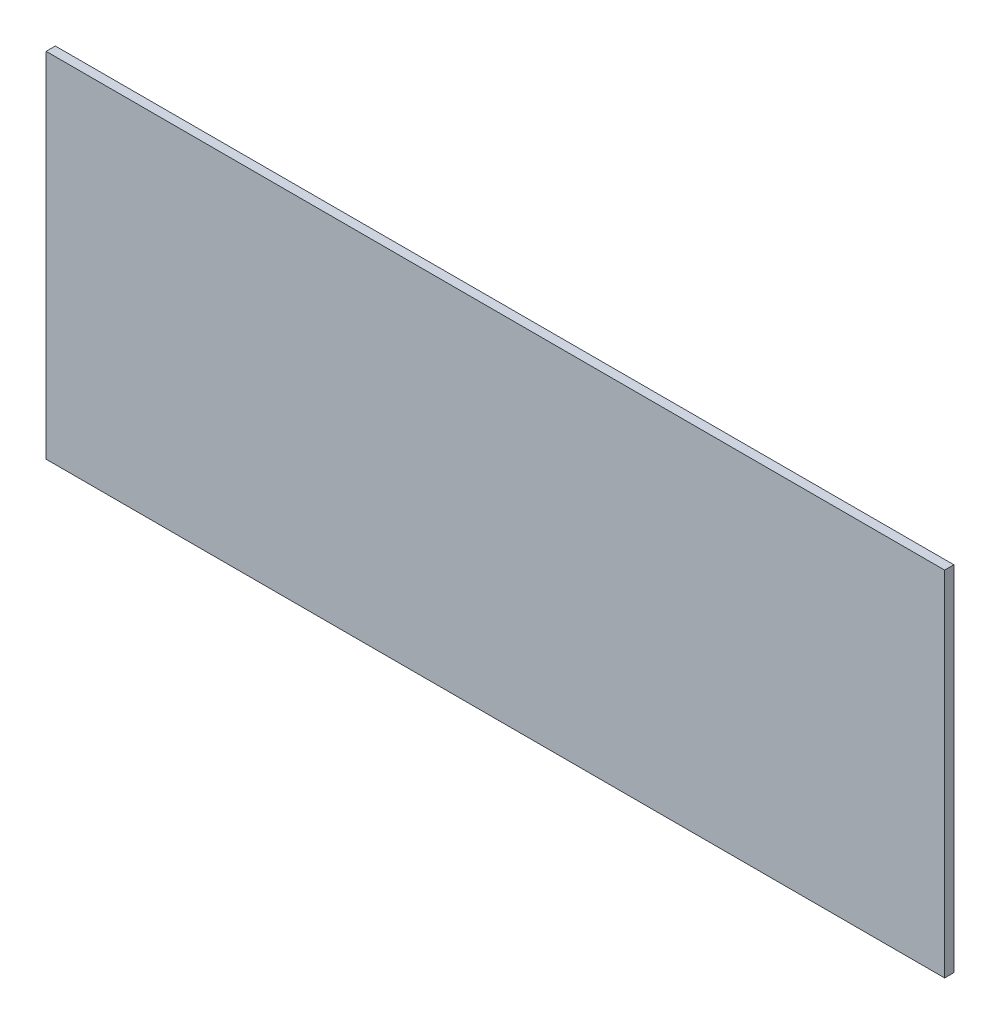
ISO-10303-21;
HEADER;
FILE_DESCRIPTION(('STEP AP214'),'2;1');
FILE_NAME('part.step','',(''),(''),'','','');
FILE_SCHEMA(('AUTOMOTIVE_DESIGN { 1 0 10303 214 1 1 1 1 }'));
ENDSEC;
DATA;
#1=APPLICATION_CONTEXT('core data for automotive mechanical design processes');
#2=APPLICATION_PROTOCOL_DEFINITION('international standard','automotive_design',2000,#1);
#3=PRODUCT_CONTEXT('',#1,'mechanical');
#4=PRODUCT('Part','Part','',(#3));
#5=PRODUCT_RELATED_PRODUCT_CATEGORY('part','',(#4));
#6=PRODUCT_DEFINITION_FORMATION('','',#4);
#7=PRODUCT_DEFINITION_CONTEXT('part definition',#1,'design');
#8=PRODUCT_DEFINITION('design','',#6,#7);
#9=PRODUCT_DEFINITION_SHAPE('','',#8);
#10=(LENGTH_UNIT() NAMED_UNIT(*) SI_UNIT(.MILLI.,.METRE.));
#11=(NAMED_UNIT(*) PLANE_ANGLE_UNIT() SI_UNIT($,.RADIAN.));
#12=(NAMED_UNIT(*) SI_UNIT($,.STERADIAN.) SOLID_ANGLE_UNIT());
#13=UNCERTAINTY_MEASURE_WITH_UNIT(LENGTH_MEASURE(1.E-05),#10,'distance_accuracy_value','');
#14=(GEOMETRIC_REPRESENTATION_CONTEXT(3) GLOBAL_UNCERTAINTY_ASSIGNED_CONTEXT((#13)) GLOBAL_UNIT_ASSIGNED_CONTEXT((#10,
#11,#12)) REPRESENTATION_CONTEXT('',''));
#15=CARTESIAN_POINT('',(0.,0.,0.));
#16=DIRECTION('',(0.,0.,1.));
#17=DIRECTION('',(1.,0.,0.));
#18=AXIS2_PLACEMENT_3D('',#15,#16,#17);
#19=CARTESIAN_POINT('',(-146.,57.3999999999999,3.));
#20=DIRECTION('',(0.,1.,0.));
#21=DIRECTION('',(0.,0.,1.));
#22=AXIS2_PLACEMENT_3D('',#19,#20,#21);
#23=PLANE('',#22);
#24=DIRECTION('',(1.,0.,0.));
#25=VECTOR('',#24,1.);
#26=CARTESIAN_POINT('',(-146.,57.3999999999999,0.));
#27=LINE('',#26,#25);
#28=CARTESIAN_POINT('',(-146.,57.3999999999999,0.));
#29=VERTEX_POINT('',#28);
#30=CARTESIAN_POINT('',(146.,57.3999999999999,0.));
#31=VERTEX_POINT('',#30);
#32=EDGE_CURVE('E99',#29,#31,#27,.T.);
#33=ORIENTED_EDGE('',*,*,#32,.F.);
#34=DIRECTION('',(0.,0.,-1.));
#35=VECTOR('',#34,1.);
#36=CARTESIAN_POINT('',(-146.,57.3999999999999,3.));
#37=LINE('',#36,#35);
#38=CARTESIAN_POINT('',(-146.,57.3999999999999,3.));
#39=VERTEX_POINT('',#38);
#40=EDGE_CURVE('E11',#39,#29,#37,.T.);
#41=ORIENTED_EDGE('',*,*,#40,.F.);
#42=DIRECTION('',(1.,0.,0.));
#43=VECTOR('',#42,1.);
#44=CARTESIAN_POINT('',(-146.,57.3999999999999,3.));
#45=LINE('',#44,#43);
#46=CARTESIAN_POINT('',(146.,57.3999999999999,3.));
#47=VERTEX_POINT('',#46);
#48=EDGE_CURVE('E93',#39,#47,#45,.T.);
#49=ORIENTED_EDGE('',*,*,#48,.T.);
#50=DIRECTION('',(0.,0.,-1.));
#51=VECTOR('',#50,1.);
#52=CARTESIAN_POINT('',(146.,57.3999999999999,3.));
#53=LINE('',#52,#51);
#54=EDGE_CURVE('E38',#47,#31,#53,.T.);
#55=ORIENTED_EDGE('',*,*,#54,.T.);
#56=EDGE_LOOP('',(#33,#41,#49,#55));
#57=FACE_BOUND('',#56,.T.);
#58=ADVANCED_FACE('F35',(#57),#23,.T.);
#59=CARTESIAN_POINT('',(-146.,-57.4,3.));
#60=DIRECTION('',(-1.,0.,0.));
#61=DIRECTION('',(0.,0.,1.));
#62=AXIS2_PLACEMENT_3D('',#59,#60,#61);
#63=PLANE('',#62);
#64=DIRECTION('',(0.,1.,0.));
#65=VECTOR('',#64,1.);
#66=CARTESIAN_POINT('',(-146.,-57.4,0.));
#67=LINE('',#66,#65);
#68=CARTESIAN_POINT('',(-146.,-57.4,0.));
#69=VERTEX_POINT('',#68);
#70=EDGE_CURVE('E95',#69,#29,#67,.T.);
#71=ORIENTED_EDGE('',*,*,#70,.F.);
#72=DIRECTION('',(0.,0.,-1.));
#73=VECTOR('',#72,1.);
#74=CARTESIAN_POINT('',(-146.,-57.4,3.));
#75=LINE('',#74,#73);
#76=CARTESIAN_POINT('',(-146.,-57.4,3.));
#77=VERTEX_POINT('',#76);
#78=EDGE_CURVE('E44',#77,#69,#75,.T.);
#79=ORIENTED_EDGE('',*,*,#78,.F.);
#80=DIRECTION('',(0.,1.,0.));
#81=VECTOR('',#80,1.);
#82=CARTESIAN_POINT('',(-146.,-57.4,3.));
#83=LINE('',#82,#81);
#84=EDGE_CURVE('E90',#77,#39,#83,.T.);
#85=ORIENTED_EDGE('',*,*,#84,.T.);
#86=ORIENTED_EDGE('',*,*,#40,.T.);
#87=EDGE_LOOP('',(#71,#79,#85,#86));
#88=FACE_BOUND('',#87,.T.);
#89=ADVANCED_FACE('F109',(#88),#63,.T.);
#90=CARTESIAN_POINT('',(146.,-57.4,3.));
#91=DIRECTION('',(0.,-1.,0.));
#92=DIRECTION('',(0.,0.,-1.));
#93=AXIS2_PLACEMENT_3D('',#90,#91,#92);
#94=PLANE('',#93);
#95=DIRECTION('',(-1.,0.,0.));
#96=VECTOR('',#95,1.);
#97=CARTESIAN_POINT('',(146.,-57.4,0.));
#98=LINE('',#97,#96);
#99=CARTESIAN_POINT('',(146.,-57.4,0.));
#100=VERTEX_POINT('',#99);
#101=EDGE_CURVE('E85',#100,#69,#98,.T.);
#102=ORIENTED_EDGE('',*,*,#101,.F.);
#103=DIRECTION('',(0.,0.,-1.));
#104=VECTOR('',#103,1.);
#105=CARTESIAN_POINT('',(146.,-57.4,3.));
#106=LINE('',#105,#104);
#107=CARTESIAN_POINT('',(146.,-57.4,3.));
#108=VERTEX_POINT('',#107);
#109=EDGE_CURVE('E80',#108,#100,#106,.T.);
#110=ORIENTED_EDGE('',*,*,#109,.F.);
#111=DIRECTION('',(-1.,0.,0.));
#112=VECTOR('',#111,1.);
#113=CARTESIAN_POINT('',(146.,-57.4,3.));
#114=LINE('',#113,#112);
#115=EDGE_CURVE('E83',#108,#77,#114,.T.);
#116=ORIENTED_EDGE('',*,*,#115,.T.);
#117=ORIENTED_EDGE('',*,*,#78,.T.);
#118=EDGE_LOOP('',(#102,#110,#116,#117));
#119=FACE_BOUND('',#118,.T.);
#120=ADVANCED_FACE('F82',(#119),#94,.T.);
#121=CARTESIAN_POINT('',(146.,57.3999999999999,3.));
#122=DIRECTION('',(1.,0.,0.));
#123=DIRECTION('',(0.,0.,-1.));
#124=AXIS2_PLACEMENT_3D('',#121,#122,#123);
#125=PLANE('',#124);
#126=DIRECTION('',(0.,-1.,0.));
#127=VECTOR('',#126,1.);
#128=CARTESIAN_POINT('',(146.,57.3999999999999,0.));
#129=LINE('',#128,#127);
#130=EDGE_CURVE('E102',#31,#100,#129,.T.);
#131=ORIENTED_EDGE('',*,*,#130,.F.);
#132=ORIENTED_EDGE('',*,*,#54,.F.);
#133=DIRECTION('',(0.,-1.,0.));
#134=VECTOR('',#133,1.);
#135=CARTESIAN_POINT('',(146.,57.3999999999999,3.));
#136=LINE('',#135,#134);
#137=EDGE_CURVE('E89',#47,#108,#136,.T.);
#138=ORIENTED_EDGE('',*,*,#137,.T.);
#139=ORIENTED_EDGE('',*,*,#109,.T.);
#140=EDGE_LOOP('',(#131,#132,#138,#139));
#141=FACE_BOUND('',#140,.T.);
#142=ADVANCED_FACE('F92',(#141),#125,.T.);
#143=CARTESIAN_POINT('',(0.,0.,3.));
#144=DIRECTION('',(0.,0.,-1.));
#145=DIRECTION('',(-1.,0.,0.));
#146=AXIS2_PLACEMENT_3D('',#143,#144,#145);
#147=PLANE('',#146);
#148=ORIENTED_EDGE('',*,*,#48,.F.);
#149=ORIENTED_EDGE('',*,*,#84,.F.);
#150=ORIENTED_EDGE('',*,*,#115,.F.);
#151=ORIENTED_EDGE('',*,*,#137,.F.);
#152=EDGE_LOOP('',(#148,#149,#150,#151));
#153=FACE_BOUND('',#152,.T.);
#154=ADVANCED_FACE('F88',(#153),#147,.F.);
#155=CARTESIAN_POINT('',(0.,0.,0.));
#156=DIRECTION('',(0.,0.,-1.));
#157=DIRECTION('',(-1.,0.,0.));
#158=AXIS2_PLACEMENT_3D('',#155,#156,#157);
#159=PLANE('',#158);
#160=ORIENTED_EDGE('',*,*,#32,.T.);
#161=ORIENTED_EDGE('',*,*,#130,.T.);
#162=ORIENTED_EDGE('',*,*,#101,.T.);
#163=ORIENTED_EDGE('',*,*,#70,.T.);
#164=EDGE_LOOP('',(#160,#161,#162,#163));
#165=FACE_BOUND('',#164,.T.);
#166=ADVANCED_FACE('F108',(#165),#159,.T.);
#167=CLOSED_SHELL('',(#58,#89,#120,#142,#154,#166));
#168=MANIFOLD_SOLID_BREP('B2',#167);
#169=ADVANCED_BREP_SHAPE_REPRESENTATION('',(#18,#168),#14);
#170=SHAPE_DEFINITION_REPRESENTATION(#9,#169);
ENDSEC;
END-ISO-10303-21;
